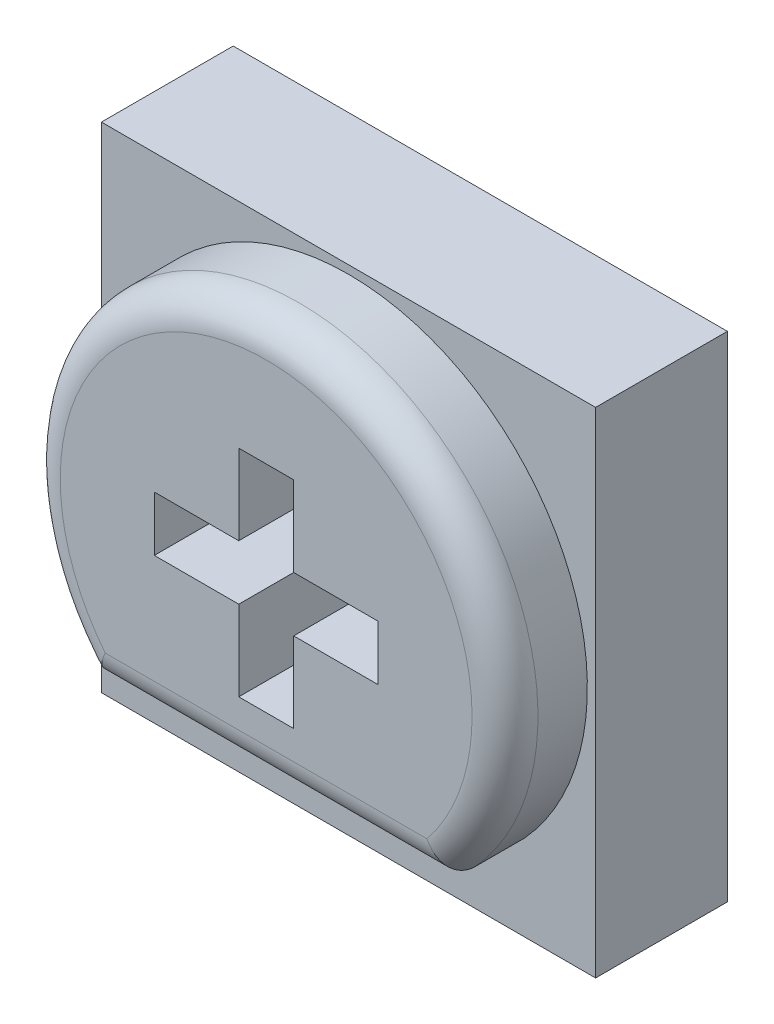
ISO-10303-21;
HEADER;
FILE_DESCRIPTION(('STEP AP214'),'2;1');
FILE_NAME('part.step','',(''),(''),'','','');
FILE_SCHEMA(('AUTOMOTIVE_DESIGN { 1 0 10303 214 1 1 1 1 }'));
ENDSEC;
DATA;
#1=APPLICATION_CONTEXT('core data for automotive mechanical design processes');
#2=APPLICATION_PROTOCOL_DEFINITION('international standard','automotive_design',2000,#1);
#3=PRODUCT_CONTEXT('',#1,'mechanical');
#4=PRODUCT('Part','Part','',(#3));
#5=PRODUCT_RELATED_PRODUCT_CATEGORY('part','',(#4));
#6=PRODUCT_DEFINITION_FORMATION('','',#4);
#7=PRODUCT_DEFINITION_CONTEXT('part definition',#1,'design');
#8=PRODUCT_DEFINITION('design','',#6,#7);
#9=PRODUCT_DEFINITION_SHAPE('','',#8);
#10=(LENGTH_UNIT() NAMED_UNIT(*) SI_UNIT(.MILLI.,.METRE.));
#11=(NAMED_UNIT(*) PLANE_ANGLE_UNIT() SI_UNIT($,.RADIAN.));
#12=(NAMED_UNIT(*) SI_UNIT($,.STERADIAN.) SOLID_ANGLE_UNIT());
#13=UNCERTAINTY_MEASURE_WITH_UNIT(LENGTH_MEASURE(1.E-05),#10,'distance_accuracy_value','');
#14=(GEOMETRIC_REPRESENTATION_CONTEXT(3) GLOBAL_UNCERTAINTY_ASSIGNED_CONTEXT((#13)) GLOBAL_UNIT_ASSIGNED_CONTEXT((#10,
#11,#12)) REPRESENTATION_CONTEXT('',''));
#15=CARTESIAN_POINT('',(0.,0.,0.));
#16=DIRECTION('',(0.,0.,1.));
#17=DIRECTION('',(1.,0.,0.));
#18=AXIS2_PLACEMENT_3D('',#15,#16,#17);
#19=CARTESIAN_POINT('',(0.,0.,1.3));
#20=DIRECTION('',(0.,0.,1.));
#21=DIRECTION('',(1.,0.,0.));
#22=AXIS2_PLACEMENT_3D('',#19,#20,#21);
#23=PLANE('',#22);
#24=CARTESIAN_POINT('',(0.,0.,1.3));
#25=DIRECTION('',(0.,0.,1.));
#26=DIRECTION('',(1.,0.,0.));
#27=AXIS2_PLACEMENT_3D('',#24,#25,#26);
#28=CIRCLE('',#27,1.25);
#29=CARTESIAN_POINT('',(0.976722388353635,-0.780072673594436,1.3));
#30=VERTEX_POINT('',#29);
#31=CARTESIAN_POINT('',(-0.976722388353635,-0.780072673594436,1.3));
#32=VERTEX_POINT('',#31);
#33=EDGE_CURVE('E267',#30,#32,#28,.T.);
#34=ORIENTED_EDGE('',*,*,#33,.T.);
#35=DIRECTION('',(1.,0.,0.));
#36=VECTOR('',#35,1.);
#37=CARTESIAN_POINT('',(1.06862414088005,-0.780072673595366,1.3));
#38=LINE('',#37,#36);
#39=EDGE_CURVE('E270',#32,#30,#38,.T.);
#40=ORIENTED_EDGE('',*,*,#39,.T.);
#41=EDGE_LOOP('',(#34,#40));
#42=FACE_BOUND('',#41,.T.);
#43=DIRECTION('',(0.,1.,0.));
#44=VECTOR('',#43,1.);
#45=CARTESIAN_POINT('',(-0.6790503810102,-0.117737433853022,1.3));
#46=LINE('',#45,#44);
#47=CARTESIAN_POINT('',(-0.6790503810102,-0.117737433853022,1.3));
#48=VERTEX_POINT('',#47);
#49=CARTESIAN_POINT('',(-0.6790503810102,0.215595899480311,1.3));
#50=VERTEX_POINT('',#49);
#51=EDGE_CURVE('E198',#48,#50,#46,.T.);
#52=ORIENTED_EDGE('',*,*,#51,.T.);
#53=DIRECTION('',(1.,0.,0.));
#54=VECTOR('',#53,1.);
#55=CARTESIAN_POINT('',(-0.6790503810102,0.215595899480311,1.3));
#56=LINE('',#55,#54);
#57=CARTESIAN_POINT('',(-0.166229868189687,0.215595899480311,1.3));
#58=VERTEX_POINT('',#57);
#59=EDGE_CURVE('E389',#50,#58,#56,.T.);
#60=ORIENTED_EDGE('',*,*,#59,.T.);
#61=DIRECTION('',(0.,1.,0.));
#62=VECTOR('',#61,1.);
#63=CARTESIAN_POINT('',(-0.166229868189687,0.215595899480311,1.3));
#64=LINE('',#63,#62);
#65=CARTESIAN_POINT('',(-0.166229868189687,0.702775386659798,1.3));
#66=VERTEX_POINT('',#65);
#67=EDGE_CURVE('E202',#58,#66,#64,.T.);
#68=ORIENTED_EDGE('',*,*,#67,.T.);
#69=DIRECTION('',(1.,0.,0.));
#70=VECTOR('',#69,1.);
#71=CARTESIAN_POINT('',(-0.166229868189687,0.702775386659798,1.3));
#72=LINE('',#71,#70);
#73=CARTESIAN_POINT('',(0.167103465143646,0.702775386659798,1.3));
#74=VERTEX_POINT('',#73);
#75=EDGE_CURVE('E394',#66,#74,#72,.T.);
#76=ORIENTED_EDGE('',*,*,#75,.T.);
#77=DIRECTION('',(0.,-1.,0.));
#78=VECTOR('',#77,1.);
#79=CARTESIAN_POINT('',(0.167103465143646,0.702775386659798,1.3));
#80=LINE('',#79,#78);
#81=CARTESIAN_POINT('',(0.167103465143646,0.215595899480311,1.3));
#82=VERTEX_POINT('',#81);
#83=EDGE_CURVE('E403',#74,#82,#80,.T.);
#84=ORIENTED_EDGE('',*,*,#83,.T.);
#85=DIRECTION('',(1.,0.,0.));
#86=VECTOR('',#85,1.);
#87=CARTESIAN_POINT('',(0.167103465143646,0.215595899480311,1.3));
#88=LINE('',#87,#86);
#89=CARTESIAN_POINT('',(0.679923977964159,0.215595899480311,1.3));
#90=VERTEX_POINT('',#89);
#91=EDGE_CURVE('E407',#82,#90,#88,.T.);
#92=ORIENTED_EDGE('',*,*,#91,.T.);
#93=DIRECTION('',(0.,-1.,0.));
#94=VECTOR('',#93,1.);
#95=CARTESIAN_POINT('',(0.679923977964159,0.215595899480311,1.3));
#96=LINE('',#95,#94);
#97=CARTESIAN_POINT('',(0.679923977964159,-0.117737433853022,1.3));
#98=VERTEX_POINT('',#97);
#99=EDGE_CURVE('E411',#90,#98,#96,.T.);
#100=ORIENTED_EDGE('',*,*,#99,.T.);
#101=DIRECTION('',(-1.,0.,0.));
#102=VECTOR('',#101,1.);
#103=CARTESIAN_POINT('',(0.679923977964159,-0.117737433853022,1.3));
#104=LINE('',#103,#102);
#105=CARTESIAN_POINT('',(0.167103465143646,-0.117737433853022,1.3));
#106=VERTEX_POINT('',#105);
#107=EDGE_CURVE('E415',#98,#106,#104,.T.);
#108=ORIENTED_EDGE('',*,*,#107,.T.);
#109=DIRECTION('',(0.,-1.,0.));
#110=VECTOR('',#109,1.);
#111=CARTESIAN_POINT('',(0.167103465143646,-0.117737433853022,1.3));
#112=LINE('',#111,#110);
#113=CARTESIAN_POINT('',(0.167103465143646,-0.60491692103251,1.3));
#114=VERTEX_POINT('',#113);
#115=EDGE_CURVE('E419',#106,#114,#112,.T.);
#116=ORIENTED_EDGE('',*,*,#115,.T.);
#117=DIRECTION('',(-1.,0.,0.));
#118=VECTOR('',#117,1.);
#119=CARTESIAN_POINT('',(0.167103465143646,-0.60491692103251,1.3));
#120=LINE('',#119,#118);
#121=CARTESIAN_POINT('',(-0.166229868189687,-0.60491692103251,1.3));
#122=VERTEX_POINT('',#121);
#123=EDGE_CURVE('E423',#114,#122,#120,.T.);
#124=ORIENTED_EDGE('',*,*,#123,.T.);
#125=DIRECTION('',(0.,1.,0.));
#126=VECTOR('',#125,1.);
#127=CARTESIAN_POINT('',(-0.166229868189687,-0.60491692103251,1.3));
#128=LINE('',#127,#126);
#129=CARTESIAN_POINT('',(-0.166229868189687,-0.117737433853022,1.3));
#130=VERTEX_POINT('',#129);
#131=EDGE_CURVE('E427',#122,#130,#128,.T.);
#132=ORIENTED_EDGE('',*,*,#131,.T.);
#133=DIRECTION('',(-1.,0.,0.));
#134=VECTOR('',#133,1.);
#135=CARTESIAN_POINT('',(-0.166229868189687,-0.117737433853022,1.3));
#136=LINE('',#135,#134);
#137=EDGE_CURVE('E431',#130,#48,#136,.T.);
#138=ORIENTED_EDGE('',*,*,#137,.T.);
#139=EDGE_LOOP('',(#52,#60,#68,#76,#84,#92,#100,#108,#116,#124,#132,#138));
#140=FACE_BOUND('',#139,.T.);
#141=ADVANCED_FACE('F39',(#42,#140),#23,.T.);
#142=CARTESIAN_POINT('',(1.5,1.5,0.8));
#143=DIRECTION('',(-1.,0.,0.));
#144=DIRECTION('',(0.,-1.,0.));
#145=AXIS2_PLACEMENT_3D('',#142,#143,#144);
#146=PLANE('',#145);
#147=DIRECTION('',(0.,1.,0.));
#148=VECTOR('',#147,1.);
#149=CARTESIAN_POINT('',(1.5,1.5,0.));
#150=LINE('',#149,#148);
#151=CARTESIAN_POINT('',(1.5,-1.5,0.));
#152=VERTEX_POINT('',#151);
#153=CARTESIAN_POINT('',(1.5,1.5,0.));
#154=VERTEX_POINT('',#153);
#155=EDGE_CURVE('E225',#152,#154,#150,.T.);
#156=ORIENTED_EDGE('',*,*,#155,.T.);
#157=DIRECTION('',(0.,0.,-1.));
#158=VECTOR('',#157,1.);
#159=CARTESIAN_POINT('',(1.5,1.5,0.8));
#160=LINE('',#159,#158);
#161=CARTESIAN_POINT('',(1.5,1.5,0.8));
#162=VERTEX_POINT('',#161);
#163=EDGE_CURVE('E263',#162,#154,#160,.T.);
#164=ORIENTED_EDGE('',*,*,#163,.F.);
#165=DIRECTION('',(0.,1.,0.));
#166=VECTOR('',#165,1.);
#167=CARTESIAN_POINT('',(1.5,1.5,0.8));
#168=LINE('',#167,#166);
#169=CARTESIAN_POINT('',(1.5,-1.5,0.8));
#170=VERTEX_POINT('',#169);
#171=EDGE_CURVE('E226',#170,#162,#168,.T.);
#172=ORIENTED_EDGE('',*,*,#171,.F.);
#173=DIRECTION('',(0.,0.,-1.));
#174=VECTOR('',#173,1.);
#175=CARTESIAN_POINT('',(1.5,-1.5,0.8));
#176=LINE('',#175,#174);
#177=EDGE_CURVE('E240',#170,#152,#176,.T.);
#178=ORIENTED_EDGE('',*,*,#177,.T.);
#179=EDGE_LOOP('',(#156,#164,#172,#178));
#180=FACE_BOUND('',#179,.T.);
#181=ADVANCED_FACE('F286',(#180),#146,.F.);
#182=CARTESIAN_POINT('',(-1.5,1.5,0.8));
#183=DIRECTION('',(0.,-1.,0.));
#184=DIRECTION('',(0.,0.,-1.));
#185=AXIS2_PLACEMENT_3D('',#182,#183,#184);
#186=PLANE('',#185);
#187=DIRECTION('',(-1.,0.,0.));
#188=VECTOR('',#187,1.);
#189=CARTESIAN_POINT('',(-1.5,1.5,0.));
#190=LINE('',#189,#188);
#191=CARTESIAN_POINT('',(-1.5,1.5,0.));
#192=VERTEX_POINT('',#191);
#193=EDGE_CURVE('E244',#154,#192,#190,.T.);
#194=ORIENTED_EDGE('',*,*,#193,.T.);
#195=DIRECTION('',(0.,0.,-1.));
#196=VECTOR('',#195,1.);
#197=CARTESIAN_POINT('',(-1.5,1.5,0.8));
#198=LINE('',#197,#196);
#199=CARTESIAN_POINT('',(-1.5,1.5,0.8));
#200=VERTEX_POINT('',#199);
#201=EDGE_CURVE('E259',#200,#192,#198,.T.);
#202=ORIENTED_EDGE('',*,*,#201,.F.);
#203=DIRECTION('',(-1.,0.,0.));
#204=VECTOR('',#203,1.);
#205=CARTESIAN_POINT('',(-1.5,1.5,0.8));
#206=LINE('',#205,#204);
#207=EDGE_CURVE('E230',#162,#200,#206,.T.);
#208=ORIENTED_EDGE('',*,*,#207,.F.);
#209=ORIENTED_EDGE('',*,*,#163,.T.);
#210=EDGE_LOOP('',(#194,#202,#208,#209));
#211=FACE_BOUND('',#210,.T.);
#212=ADVANCED_FACE('F290',(#211),#186,.F.);
#213=CARTESIAN_POINT('',(-1.5,1.5,0.8));
#214=DIRECTION('',(1.,0.,0.));
#215=DIRECTION('',(0.,1.,0.));
#216=AXIS2_PLACEMENT_3D('',#213,#214,#215);
#217=PLANE('',#216);
#218=DIRECTION('',(0.,-1.,0.));
#219=VECTOR('',#218,1.);
#220=CARTESIAN_POINT('',(-1.5,1.5,0.));
#221=LINE('',#220,#219);
#222=CARTESIAN_POINT('',(-1.5,-1.5,0.));
#223=VERTEX_POINT('',#222);
#224=EDGE_CURVE('E247',#192,#223,#221,.T.);
#225=ORIENTED_EDGE('',*,*,#224,.T.);
#226=DIRECTION('',(0.,0.,-1.));
#227=VECTOR('',#226,1.);
#228=CARTESIAN_POINT('',(-1.5,-1.5,0.8));
#229=LINE('',#228,#227);
#230=CARTESIAN_POINT('',(-1.5,-1.5,0.8));
#231=VERTEX_POINT('',#230);
#232=EDGE_CURVE('E255',#231,#223,#229,.T.);
#233=ORIENTED_EDGE('',*,*,#232,.F.);
#234=DIRECTION('',(0.,-1.,0.));
#235=VECTOR('',#234,1.);
#236=CARTESIAN_POINT('',(-1.5,1.5,0.8));
#237=LINE('',#236,#235);
#238=EDGE_CURVE('E234',#200,#231,#237,.T.);
#239=ORIENTED_EDGE('',*,*,#238,.F.);
#240=ORIENTED_EDGE('',*,*,#201,.T.);
#241=EDGE_LOOP('',(#225,#233,#239,#240));
#242=FACE_BOUND('',#241,.T.);
#243=ADVANCED_FACE('F294',(#242),#217,.F.);
#244=CARTESIAN_POINT('',(-1.5,-1.5,0.8));
#245=DIRECTION('',(0.,1.,0.));
#246=DIRECTION('',(0.,0.,1.));
#247=AXIS2_PLACEMENT_3D('',#244,#245,#246);
#248=PLANE('',#247);
#249=DIRECTION('',(1.,0.,0.));
#250=VECTOR('',#249,1.);
#251=CARTESIAN_POINT('',(-1.5,-1.5,0.));
#252=LINE('',#251,#250);
#253=EDGE_CURVE('E231',#223,#152,#252,.T.);
#254=ORIENTED_EDGE('',*,*,#253,.T.);
#255=ORIENTED_EDGE('',*,*,#177,.F.);
#256=DIRECTION('',(1.,0.,0.));
#257=VECTOR('',#256,1.);
#258=CARTESIAN_POINT('',(-1.5,-1.5,0.8));
#259=LINE('',#258,#257);
#260=EDGE_CURVE('E237',#231,#170,#259,.T.);
#261=ORIENTED_EDGE('',*,*,#260,.F.);
#262=ORIENTED_EDGE('',*,*,#232,.T.);
#263=EDGE_LOOP('',(#254,#255,#261,#262));
#264=FACE_BOUND('',#263,.T.);
#265=ADVANCED_FACE('F298',(#264),#248,.F.);
#266=CARTESIAN_POINT('',(0.,0.,0.8));
#267=DIRECTION('',(0.,0.,1.));
#268=DIRECTION('',(1.,0.,0.));
#269=AXIS2_PLACEMENT_3D('',#266,#267,#268);
#270=PLANE('',#269);
#271=CARTESIAN_POINT('',(0.,0.,0.8));
#272=DIRECTION('',(0.,0.,1.));
#273=DIRECTION('',(1.,0.,0.));
#274=AXIS2_PLACEMENT_3D('',#271,#272,#273);
#275=CIRCLE('',#274,1.45);
#276=CARTESIAN_POINT('',(1.06862414088005,-0.980072673595366,0.8));
#277=VERTEX_POINT('',#276);
#278=CARTESIAN_POINT('',(-1.06862414088005,-0.980072673595366,0.8));
#279=VERTEX_POINT('',#278);
#280=EDGE_CURVE('E204',#277,#279,#275,.T.);
#281=ORIENTED_EDGE('',*,*,#280,.F.);
#282=DIRECTION('',(1.,0.,0.));
#283=VECTOR('',#282,1.);
#284=CARTESIAN_POINT('',(-1.06862414088005,-0.980072673595366,0.8));
#285=LINE('',#284,#283);
#286=EDGE_CURVE('E210',#279,#277,#285,.T.);
#287=ORIENTED_EDGE('',*,*,#286,.F.);
#288=EDGE_LOOP('',(#281,#287));
#289=FACE_BOUND('',#288,.T.);
#290=ORIENTED_EDGE('',*,*,#171,.T.);
#291=ORIENTED_EDGE('',*,*,#207,.T.);
#292=ORIENTED_EDGE('',*,*,#238,.T.);
#293=ORIENTED_EDGE('',*,*,#260,.T.);
#294=EDGE_LOOP('',(#290,#291,#292,#293));
#295=FACE_BOUND('',#294,.T.);
#296=ADVANCED_FACE('F302',(#289,#295),#270,.T.);
#297=CARTESIAN_POINT('',(0.,0.,0.));
#298=DIRECTION('',(0.,0.,1.));
#299=DIRECTION('',(1.,0.,0.));
#300=AXIS2_PLACEMENT_3D('',#297,#298,#299);
#301=PLANE('',#300);
#302=ORIENTED_EDGE('',*,*,#155,.F.);
#303=ORIENTED_EDGE('',*,*,#253,.F.);
#304=ORIENTED_EDGE('',*,*,#224,.F.);
#305=ORIENTED_EDGE('',*,*,#193,.F.);
#306=EDGE_LOOP('',(#302,#303,#304,#305));
#307=FACE_BOUND('',#306,.T.);
#308=ADVANCED_FACE('F304',(#307),#301,.F.);
#309=CARTESIAN_POINT('',(0.,0.,1.3));
#310=DIRECTION('',(0.,0.,-1.));
#311=DIRECTION('',(-1.,0.,0.));
#312=AXIS2_PLACEMENT_3D('',#309,#310,#311);
#313=CYLINDRICAL_SURFACE('',#312,1.45);
#314=DIRECTION('',(0.,0.,-1.));
#315=VECTOR('',#314,1.);
#316=CARTESIAN_POINT('',(-1.06862414088005,-0.980072673595366,1.3));
#317=LINE('',#316,#315);
#318=CARTESIAN_POINT('',(-1.06862414088005,-0.980072673595366,1.1));
#319=VERTEX_POINT('',#318);
#320=EDGE_CURVE('E222',#319,#279,#317,.T.);
#321=ORIENTED_EDGE('',*,*,#320,.F.);
#322=CARTESIAN_POINT('',(0.,0.,1.1));
#323=DIRECTION('',(0.,0.,1.));
#324=DIRECTION('',(1.,0.,0.));
#325=AXIS2_PLACEMENT_3D('',#322,#323,#324);
#326=CIRCLE('',#325,1.45);
#327=CARTESIAN_POINT('',(1.06862414088005,-0.980072673595366,1.1));
#328=VERTEX_POINT('',#327);
#329=EDGE_CURVE('E11',#319,#328,#326,.F.);
#330=ORIENTED_EDGE('',*,*,#329,.T.);
#331=DIRECTION('',(0.,0.,-1.));
#332=VECTOR('',#331,1.);
#333=CARTESIAN_POINT('',(1.06862414088005,-0.980072673595366,1.3));
#334=LINE('',#333,#332);
#335=EDGE_CURVE('E219',#328,#277,#334,.T.);
#336=ORIENTED_EDGE('',*,*,#335,.T.);
#337=ORIENTED_EDGE('',*,*,#280,.T.);
#338=EDGE_LOOP('',(#321,#330,#336,#337));
#339=FACE_BOUND('',#338,.T.);
#340=ADVANCED_FACE('F307',(#339),#313,.T.);
#341=CARTESIAN_POINT('',(-1.06862414088005,-0.980072673595366,1.3));
#342=DIRECTION('',(0.,1.,0.));
#343=DIRECTION('',(0.,0.,1.));
#344=AXIS2_PLACEMENT_3D('',#341,#342,#343);
#345=PLANE('',#344);
#346=ORIENTED_EDGE('',*,*,#335,.F.);
#347=DIRECTION('',(1.,0.,0.));
#348=VECTOR('',#347,1.);
#349=CARTESIAN_POINT('',(-1.06862414088005,-0.980072673595366,1.1));
#350=LINE('',#349,#348);
#351=EDGE_CURVE('E54',#328,#319,#350,.F.);
#352=ORIENTED_EDGE('',*,*,#351,.T.);
#353=ORIENTED_EDGE('',*,*,#320,.T.);
#354=ORIENTED_EDGE('',*,*,#286,.T.);
#355=EDGE_LOOP('',(#346,#352,#353,#354));
#356=FACE_BOUND('',#355,.T.);
#357=ADVANCED_FACE('F314',(#356),#345,.F.);
#358=CARTESIAN_POINT('',(-0.6790503810102,0.215595899480311,0.5));
#359=DIRECTION('',(0.,-1.,0.));
#360=DIRECTION('',(0.,0.,-1.));
#361=AXIS2_PLACEMENT_3D('',#358,#359,#360);
#362=PLANE('',#361);
#363=ORIENTED_EDGE('',*,*,#59,.F.);
#364=DIRECTION('',(0.,0.,1.));
#365=VECTOR('',#364,1.);
#366=CARTESIAN_POINT('',(-0.6790503810102,0.215595899480311,0.5));
#367=LINE('',#366,#365);
#368=CARTESIAN_POINT('',(-0.6790503810102,0.215595899480311,0.5));
#369=VERTEX_POINT('',#368);
#370=EDGE_CURVE('E196',#369,#50,#367,.T.);
#371=ORIENTED_EDGE('',*,*,#370,.F.);
#372=DIRECTION('',(1.,0.,0.));
#373=VECTOR('',#372,1.);
#374=CARTESIAN_POINT('',(-0.6790503810102,0.215595899480311,0.5));
#375=LINE('',#374,#373);
#376=CARTESIAN_POINT('',(-0.166229868189687,0.215595899480311,0.5));
#377=VERTEX_POINT('',#376);
#378=EDGE_CURVE('E181',#369,#377,#375,.T.);
#379=ORIENTED_EDGE('',*,*,#378,.T.);
#380=DIRECTION('',(0.,0.,1.));
#381=VECTOR('',#380,1.);
#382=CARTESIAN_POINT('',(-0.166229868189687,0.215595899480311,0.5));
#383=LINE('',#382,#381);
#384=EDGE_CURVE('E193',#377,#58,#383,.T.);
#385=ORIENTED_EDGE('',*,*,#384,.T.);
#386=EDGE_LOOP('',(#363,#371,#379,#385));
#387=FACE_BOUND('',#386,.T.);
#388=ADVANCED_FACE('F192',(#387),#362,.T.);
#389=CARTESIAN_POINT('',(-0.166229868189687,0.215595899480311,0.5));
#390=DIRECTION('',(1.,0.,0.));
#391=DIRECTION('',(0.,0.,-1.));
#392=AXIS2_PLACEMENT_3D('',#389,#390,#391);
#393=PLANE('',#392);
#394=ORIENTED_EDGE('',*,*,#67,.F.);
#395=ORIENTED_EDGE('',*,*,#384,.F.);
#396=DIRECTION('',(0.,1.,0.));
#397=VECTOR('',#396,1.);
#398=CARTESIAN_POINT('',(-0.166229868189687,0.215595899480311,0.5));
#399=LINE('',#398,#397);
#400=CARTESIAN_POINT('',(-0.166229868189687,0.702775386659798,0.5));
#401=VERTEX_POINT('',#400);
#402=EDGE_CURVE('E177',#377,#401,#399,.T.);
#403=ORIENTED_EDGE('',*,*,#402,.T.);
#404=DIRECTION('',(0.,0.,1.));
#405=VECTOR('',#404,1.);
#406=CARTESIAN_POINT('',(-0.166229868189687,0.702775386659798,0.5));
#407=LINE('',#406,#405);
#408=EDGE_CURVE('E205',#401,#66,#407,.T.);
#409=ORIENTED_EDGE('',*,*,#408,.T.);
#410=EDGE_LOOP('',(#394,#395,#403,#409));
#411=FACE_BOUND('',#410,.T.);
#412=ADVANCED_FACE('F200',(#411),#393,.T.);
#413=CARTESIAN_POINT('',(-0.166229868189687,0.702775386659798,0.5));
#414=DIRECTION('',(0.,-1.,0.));
#415=DIRECTION('',(0.,0.,-1.));
#416=AXIS2_PLACEMENT_3D('',#413,#414,#415);
#417=PLANE('',#416);
#418=ORIENTED_EDGE('',*,*,#75,.F.);
#419=ORIENTED_EDGE('',*,*,#408,.F.);
#420=DIRECTION('',(1.,0.,0.));
#421=VECTOR('',#420,1.);
#422=CARTESIAN_POINT('',(-0.166229868189687,0.702775386659798,0.5));
#423=LINE('',#422,#421);
#424=CARTESIAN_POINT('',(0.167103465143646,0.702775386659798,0.5));
#425=VERTEX_POINT('',#424);
#426=EDGE_CURVE('E183',#401,#425,#423,.T.);
#427=ORIENTED_EDGE('',*,*,#426,.T.);
#428=DIRECTION('',(0.,0.,1.));
#429=VECTOR('',#428,1.);
#430=CARTESIAN_POINT('',(0.167103465143646,0.702775386659798,0.5));
#431=LINE('',#430,#429);
#432=EDGE_CURVE('E212',#425,#74,#431,.T.);
#433=ORIENTED_EDGE('',*,*,#432,.T.);
#434=EDGE_LOOP('',(#418,#419,#427,#433));
#435=FACE_BOUND('',#434,.T.);
#436=ADVANCED_FACE('F325',(#435),#417,.T.);
#437=CARTESIAN_POINT('',(0.167103465143646,0.702775386659798,0.5));
#438=DIRECTION('',(-1.,0.,0.));
#439=DIRECTION('',(0.,0.,1.));
#440=AXIS2_PLACEMENT_3D('',#437,#438,#439);
#441=PLANE('',#440);
#442=ORIENTED_EDGE('',*,*,#83,.F.);
#443=ORIENTED_EDGE('',*,*,#432,.F.);
#444=DIRECTION('',(0.,-1.,0.));
#445=VECTOR('',#444,1.);
#446=CARTESIAN_POINT('',(0.167103465143646,0.702775386659798,0.5));
#447=LINE('',#446,#445);
#448=CARTESIAN_POINT('',(0.167103465143646,0.215595899480311,0.5));
#449=VERTEX_POINT('',#448);
#450=EDGE_CURVE('E495',#425,#449,#447,.T.);
#451=ORIENTED_EDGE('',*,*,#450,.T.);
#452=DIRECTION('',(0.,0.,1.));
#453=VECTOR('',#452,1.);
#454=CARTESIAN_POINT('',(0.167103465143646,0.215595899480311,0.5));
#455=LINE('',#454,#453);
#456=EDGE_CURVE('E460',#449,#82,#455,.T.);
#457=ORIENTED_EDGE('',*,*,#456,.T.);
#458=EDGE_LOOP('',(#442,#443,#451,#457));
#459=FACE_BOUND('',#458,.T.);
#460=ADVANCED_FACE('F328',(#459),#441,.T.);
#461=CARTESIAN_POINT('',(0.167103465143646,0.215595899480311,0.5));
#462=DIRECTION('',(0.,-1.,0.));
#463=DIRECTION('',(0.,0.,-1.));
#464=AXIS2_PLACEMENT_3D('',#461,#462,#463);
#465=PLANE('',#464);
#466=ORIENTED_EDGE('',*,*,#91,.F.);
#467=ORIENTED_EDGE('',*,*,#456,.F.);
#468=DIRECTION('',(1.,0.,0.));
#469=VECTOR('',#468,1.);
#470=CARTESIAN_POINT('',(0.167103465143646,0.215595899480311,0.5));
#471=LINE('',#470,#469);
#472=CARTESIAN_POINT('',(0.679923977964159,0.215595899480311,0.5));
#473=VERTEX_POINT('',#472);
#474=EDGE_CURVE('E492',#449,#473,#471,.T.);
#475=ORIENTED_EDGE('',*,*,#474,.T.);
#476=DIRECTION('',(0.,0.,1.));
#477=VECTOR('',#476,1.);
#478=CARTESIAN_POINT('',(0.679923977964159,0.215595899480311,0.5));
#479=LINE('',#478,#477);
#480=EDGE_CURVE('E457',#473,#90,#479,.T.);
#481=ORIENTED_EDGE('',*,*,#480,.T.);
#482=EDGE_LOOP('',(#466,#467,#475,#481));
#483=FACE_BOUND('',#482,.T.);
#484=ADVANCED_FACE('F332',(#483),#465,.T.);
#485=CARTESIAN_POINT('',(0.679923977964159,0.215595899480311,0.5));
#486=DIRECTION('',(-1.,0.,0.));
#487=DIRECTION('',(0.,0.,1.));
#488=AXIS2_PLACEMENT_3D('',#485,#486,#487);
#489=PLANE('',#488);
#490=ORIENTED_EDGE('',*,*,#99,.F.);
#491=ORIENTED_EDGE('',*,*,#480,.F.);
#492=DIRECTION('',(0.,-1.,0.));
#493=VECTOR('',#492,1.);
#494=CARTESIAN_POINT('',(0.679923977964159,0.215595899480311,0.5));
#495=LINE('',#494,#493);
#496=CARTESIAN_POINT('',(0.679923977964159,-0.117737433853022,0.5));
#497=VERTEX_POINT('',#496);
#498=EDGE_CURVE('E489',#473,#497,#495,.T.);
#499=ORIENTED_EDGE('',*,*,#498,.T.);
#500=DIRECTION('',(0.,0.,1.));
#501=VECTOR('',#500,1.);
#502=CARTESIAN_POINT('',(0.679923977964159,-0.117737433853022,0.5));
#503=LINE('',#502,#501);
#504=EDGE_CURVE('E454',#497,#98,#503,.T.);
#505=ORIENTED_EDGE('',*,*,#504,.T.);
#506=EDGE_LOOP('',(#490,#491,#499,#505));
#507=FACE_BOUND('',#506,.T.);
#508=ADVANCED_FACE('F336',(#507),#489,.T.);
#509=CARTESIAN_POINT('',(0.679923977964159,-0.117737433853022,0.5));
#510=DIRECTION('',(0.,1.,0.));
#511=DIRECTION('',(0.,0.,1.));
#512=AXIS2_PLACEMENT_3D('',#509,#510,#511);
#513=PLANE('',#512);
#514=ORIENTED_EDGE('',*,*,#107,.F.);
#515=ORIENTED_EDGE('',*,*,#504,.F.);
#516=DIRECTION('',(-1.,0.,0.));
#517=VECTOR('',#516,1.);
#518=CARTESIAN_POINT('',(0.679923977964159,-0.117737433853022,0.5));
#519=LINE('',#518,#517);
#520=CARTESIAN_POINT('',(0.167103465143646,-0.117737433853022,0.5));
#521=VERTEX_POINT('',#520);
#522=EDGE_CURVE('E486',#497,#521,#519,.T.);
#523=ORIENTED_EDGE('',*,*,#522,.T.);
#524=DIRECTION('',(0.,0.,1.));
#525=VECTOR('',#524,1.);
#526=CARTESIAN_POINT('',(0.167103465143646,-0.117737433853022,0.5));
#527=LINE('',#526,#525);
#528=EDGE_CURVE('E451',#521,#106,#527,.T.);
#529=ORIENTED_EDGE('',*,*,#528,.T.);
#530=EDGE_LOOP('',(#514,#515,#523,#529));
#531=FACE_BOUND('',#530,.T.);
#532=ADVANCED_FACE('F340',(#531),#513,.T.);
#533=CARTESIAN_POINT('',(0.167103465143646,-0.117737433853022,0.5));
#534=DIRECTION('',(-1.,0.,0.));
#535=DIRECTION('',(0.,0.,1.));
#536=AXIS2_PLACEMENT_3D('',#533,#534,#535);
#537=PLANE('',#536);
#538=ORIENTED_EDGE('',*,*,#115,.F.);
#539=ORIENTED_EDGE('',*,*,#528,.F.);
#540=DIRECTION('',(0.,-1.,0.));
#541=VECTOR('',#540,1.);
#542=CARTESIAN_POINT('',(0.167103465143646,-0.117737433853022,0.5));
#543=LINE('',#542,#541);
#544=CARTESIAN_POINT('',(0.167103465143646,-0.60491692103251,0.5));
#545=VERTEX_POINT('',#544);
#546=EDGE_CURVE('E483',#521,#545,#543,.T.);
#547=ORIENTED_EDGE('',*,*,#546,.T.);
#548=DIRECTION('',(0.,0.,1.));
#549=VECTOR('',#548,1.);
#550=CARTESIAN_POINT('',(0.167103465143646,-0.60491692103251,0.5));
#551=LINE('',#550,#549);
#552=EDGE_CURVE('E448',#545,#114,#551,.T.);
#553=ORIENTED_EDGE('',*,*,#552,.T.);
#554=EDGE_LOOP('',(#538,#539,#547,#553));
#555=FACE_BOUND('',#554,.T.);
#556=ADVANCED_FACE('F344',(#555),#537,.T.);
#557=CARTESIAN_POINT('',(0.167103465143646,-0.60491692103251,0.5));
#558=DIRECTION('',(0.,1.,0.));
#559=DIRECTION('',(0.,0.,1.));
#560=AXIS2_PLACEMENT_3D('',#557,#558,#559);
#561=PLANE('',#560);
#562=ORIENTED_EDGE('',*,*,#123,.F.);
#563=ORIENTED_EDGE('',*,*,#552,.F.);
#564=DIRECTION('',(-1.,0.,0.));
#565=VECTOR('',#564,1.);
#566=CARTESIAN_POINT('',(0.167103465143646,-0.60491692103251,0.5));
#567=LINE('',#566,#565);
#568=CARTESIAN_POINT('',(-0.166229868189687,-0.60491692103251,0.5));
#569=VERTEX_POINT('',#568);
#570=EDGE_CURVE('E478',#545,#569,#567,.T.);
#571=ORIENTED_EDGE('',*,*,#570,.T.);
#572=DIRECTION('',(0.,0.,1.));
#573=VECTOR('',#572,1.);
#574=CARTESIAN_POINT('',(-0.166229868189687,-0.60491692103251,0.5));
#575=LINE('',#574,#573);
#576=EDGE_CURVE('E445',#569,#122,#575,.T.);
#577=ORIENTED_EDGE('',*,*,#576,.T.);
#578=EDGE_LOOP('',(#562,#563,#571,#577));
#579=FACE_BOUND('',#578,.T.);
#580=ADVANCED_FACE('F348',(#579),#561,.T.);
#581=CARTESIAN_POINT('',(-0.166229868189687,-0.60491692103251,0.5));
#582=DIRECTION('',(1.,0.,0.));
#583=DIRECTION('',(0.,0.,-1.));
#584=AXIS2_PLACEMENT_3D('',#581,#582,#583);
#585=PLANE('',#584);
#586=ORIENTED_EDGE('',*,*,#131,.F.);
#587=ORIENTED_EDGE('',*,*,#576,.F.);
#588=DIRECTION('',(0.,1.,0.));
#589=VECTOR('',#588,1.);
#590=CARTESIAN_POINT('',(-0.166229868189687,-0.60491692103251,0.5));
#591=LINE('',#590,#589);
#592=CARTESIAN_POINT('',(-0.166229868189687,-0.117737433853022,0.5));
#593=VERTEX_POINT('',#592);
#594=EDGE_CURVE('E475',#569,#593,#591,.T.);
#595=ORIENTED_EDGE('',*,*,#594,.T.);
#596=DIRECTION('',(0.,0.,1.));
#597=VECTOR('',#596,1.);
#598=CARTESIAN_POINT('',(-0.166229868189687,-0.117737433853022,0.5));
#599=LINE('',#598,#597);
#600=EDGE_CURVE('E442',#593,#130,#599,.T.);
#601=ORIENTED_EDGE('',*,*,#600,.T.);
#602=EDGE_LOOP('',(#586,#587,#595,#601));
#603=FACE_BOUND('',#602,.T.);
#604=ADVANCED_FACE('F352',(#603),#585,.T.);
#605=CARTESIAN_POINT('',(-0.166229868189687,-0.117737433853022,0.5));
#606=DIRECTION('',(0.,1.,0.));
#607=DIRECTION('',(0.,0.,1.));
#608=AXIS2_PLACEMENT_3D('',#605,#606,#607);
#609=PLANE('',#608);
#610=ORIENTED_EDGE('',*,*,#137,.F.);
#611=ORIENTED_EDGE('',*,*,#600,.F.);
#612=DIRECTION('',(-1.,0.,0.));
#613=VECTOR('',#612,1.);
#614=CARTESIAN_POINT('',(-0.166229868189687,-0.117737433853022,0.5));
#615=LINE('',#614,#613);
#616=CARTESIAN_POINT('',(-0.6790503810102,-0.117737433853022,0.5));
#617=VERTEX_POINT('',#616);
#618=EDGE_CURVE('E473',#593,#617,#615,.T.);
#619=ORIENTED_EDGE('',*,*,#618,.T.);
#620=DIRECTION('',(0.,0.,1.));
#621=VECTOR('',#620,1.);
#622=CARTESIAN_POINT('',(-0.6790503810102,-0.117737433853022,0.5));
#623=LINE('',#622,#621);
#624=EDGE_CURVE('E439',#617,#48,#623,.T.);
#625=ORIENTED_EDGE('',*,*,#624,.T.);
#626=EDGE_LOOP('',(#610,#611,#619,#625));
#627=FACE_BOUND('',#626,.T.);
#628=ADVANCED_FACE('F356',(#627),#609,.T.);
#629=CARTESIAN_POINT('',(-0.6790503810102,-0.117737433853022,0.5));
#630=DIRECTION('',(1.,0.,0.));
#631=DIRECTION('',(0.,0.,-1.));
#632=AXIS2_PLACEMENT_3D('',#629,#630,#631);
#633=PLANE('',#632);
#634=ORIENTED_EDGE('',*,*,#51,.F.);
#635=ORIENTED_EDGE('',*,*,#624,.F.);
#636=DIRECTION('',(0.,1.,0.));
#637=VECTOR('',#636,1.);
#638=CARTESIAN_POINT('',(-0.6790503810102,-0.117737433853022,0.5));
#639=LINE('',#638,#637);
#640=EDGE_CURVE('E397',#617,#369,#639,.T.);
#641=ORIENTED_EDGE('',*,*,#640,.T.);
#642=ORIENTED_EDGE('',*,*,#370,.T.);
#643=EDGE_LOOP('',(#634,#635,#641,#642));
#644=FACE_BOUND('',#643,.T.);
#645=ADVANCED_FACE('F360',(#644),#633,.T.);
#646=CARTESIAN_POINT('',(0.,0.,0.5));
#647=DIRECTION('',(0.,0.,1.));
#648=DIRECTION('',(1.,0.,0.));
#649=AXIS2_PLACEMENT_3D('',#646,#647,#648);
#650=PLANE('',#649);
#651=ORIENTED_EDGE('',*,*,#378,.F.);
#652=ORIENTED_EDGE('',*,*,#640,.F.);
#653=ORIENTED_EDGE('',*,*,#618,.F.);
#654=ORIENTED_EDGE('',*,*,#594,.F.);
#655=ORIENTED_EDGE('',*,*,#570,.F.);
#656=ORIENTED_EDGE('',*,*,#546,.F.);
#657=ORIENTED_EDGE('',*,*,#522,.F.);
#658=ORIENTED_EDGE('',*,*,#498,.F.);
#659=ORIENTED_EDGE('',*,*,#474,.F.);
#660=ORIENTED_EDGE('',*,*,#450,.F.);
#661=ORIENTED_EDGE('',*,*,#426,.F.);
#662=ORIENTED_EDGE('',*,*,#402,.F.);
#663=EDGE_LOOP('',(#651,#652,#653,#654,#655,#656,#657,#658,#659,#660,#661,#662));
#664=FACE_BOUND('',#663,.T.);
#665=ADVANCED_FACE('F179',(#664),#650,.T.);
#666=CARTESIAN_POINT('',(0.,0.,1.1));
#667=DIRECTION('',(0.,0.,1.));
#668=DIRECTION('',(1.,0.,0.));
#669=AXIS2_PLACEMENT_3D('',#666,#667,#668);
#670=TOROIDAL_SURFACE('',#669,1.25,0.2);
#671=CARTESIAN_POINT('',(1.06862414088005,-0.980072673595366,1.1));
#672=CARTESIAN_POINT('',(1.06862877738244,-0.980084892656286,1.11055385822671));
#673=CARTESIAN_POINT('',(1.06825714892109,-0.979238140761556,1.12109973093428));
#674=CARTESIAN_POINT('',(1.0667979997634,-0.975922535779073,1.14185182536485));
#675=CARTESIAN_POINT('',(1.06571258083091,-0.973458445003825,1.15205895212045));
#676=CARTESIAN_POINT('',(1.06286253644352,-0.967003971439888,1.17187218442056));
#677=CARTESIAN_POINT('',(1.06109811629514,-0.963014050011971,1.1814784706188));
#678=CARTESIAN_POINT('',(1.05695043410757,-0.953666833543092,1.1998566095634));
#679=CARTESIAN_POINT('',(1.05456692361638,-0.948308989545124,1.20862812536595));
#680=CARTESIAN_POINT('',(1.04916628474931,-0.936219978493928,1.22541327952572));
#681=CARTESIAN_POINT('',(1.04613099359213,-0.929449649694686,1.23339277789823));
#682=CARTESIAN_POINT('',(1.03956404251412,-0.914876494174229,1.24810549003463));
#683=CARTESIAN_POINT('',(1.03603222660289,-0.907073343022253,1.25483831059053));
#684=CARTESIAN_POINT('',(1.02826113795755,-0.89000252965373,1.26744199038934));
#685=CARTESIAN_POINT('',(1.02398786215229,-0.880667631335978,1.27320066417882));
#686=CARTESIAN_POINT('',(1.01507279336763,-0.861325973056358,1.28307340363904));
#687=CARTESIAN_POINT('',(1.01043083126259,-0.851318905082025,1.28718670925465));
#688=CARTESIAN_POINT('',(1.00123376635672,-0.831636837022603,1.29349452016646));
#689=CARTESIAN_POINT('',(0.996696835984622,-0.821990496087636,1.29580667655096));
#690=CARTESIAN_POINT('',(0.987484892183164,-0.802542804162716,1.29897705190524));
#691=CARTESIAN_POINT('',(0.982810151767205,-0.792741775458933,1.29983797170362));
#692=CARTESIAN_POINT('',(0.977646941357499,-0.781994992269259,1.29999308573319));
#693=CARTESIAN_POINT('',(0.977184770979174,-0.781033708907868,1.30000001513914));
#694=CARTESIAN_POINT('',(0.976722388352892,-0.780072673595366,1.3));
#695=B_SPLINE_CURVE_WITH_KNOTS('',3,(#671,#672,#673,#674,#675,#676,#677,#678,#679,#680,#681,
#682,#683,#684,#685,#686,#687,#688,#689,#690,#691,#692,#693,#694),.UNSPECIFIED.,.F.,.F.,(4,2,2,
2,2,2,2,2,2,2,2,4),(0.,0.0316087378156173,0.0631248176054801,0.0946313754991534,
0.126150597126021,0.158699978796571,0.19125960927107,0.22642633498686,0.261609286778808,
0.294237252545277,0.326804428615449,0.330004234356813),.UNSPECIFIED.);
#696=EDGE_CURVE('E276',#328,#30,#695,.T.);
#697=ORIENTED_EDGE('',*,*,#696,.F.);
#698=ORIENTED_EDGE('',*,*,#329,.F.);
#699=CARTESIAN_POINT('',(-1.06862414088005,-0.980072673595366,1.1));
#700=CARTESIAN_POINT('',(-1.06862877738244,-0.980084892656286,1.11055385822671));
#701=CARTESIAN_POINT('',(-1.06825714892109,-0.979238140761556,1.12109973093428));
#702=CARTESIAN_POINT('',(-1.0667979997634,-0.975922535779073,1.14185182536485));
#703=CARTESIAN_POINT('',(-1.06571258083091,-0.973458445003825,1.15205895212045));
#704=CARTESIAN_POINT('',(-1.06286253644352,-0.967003971439888,1.17187218442056));
#705=CARTESIAN_POINT('',(-1.06109811629514,-0.963014050011971,1.1814784706188));
#706=CARTESIAN_POINT('',(-1.05695043410757,-0.953666833543092,1.1998566095634));
#707=CARTESIAN_POINT('',(-1.05456692361638,-0.948308989545124,1.20862812536595));
#708=CARTESIAN_POINT('',(-1.04916628474931,-0.936219978493928,1.22541327952572));
#709=CARTESIAN_POINT('',(-1.04613099359213,-0.929449649694686,1.23339277789823));
#710=CARTESIAN_POINT('',(-1.03956404251412,-0.914876494174229,1.24810549003463));
#711=CARTESIAN_POINT('',(-1.03603222660289,-0.907073343022253,1.25483831059053));
#712=CARTESIAN_POINT('',(-1.02826113795755,-0.89000252965373,1.26744199038934));
#713=CARTESIAN_POINT('',(-1.02398786215229,-0.880667631335978,1.27320066417882));
#714=CARTESIAN_POINT('',(-1.01507279336763,-0.861325973056358,1.28307340363904));
#715=CARTESIAN_POINT('',(-1.01043083126259,-0.851318905082025,1.28718670925465));
#716=CARTESIAN_POINT('',(-1.00123376635672,-0.831636837022603,1.29349452016646));
#717=CARTESIAN_POINT('',(-0.996696835984623,-0.821990496087635,1.29580667655096));
#718=CARTESIAN_POINT('',(-0.987484892183163,-0.802542804162716,1.29897705190524));
#719=CARTESIAN_POINT('',(-0.982810151767201,-0.792741775458934,1.29983797170362));
#720=CARTESIAN_POINT('',(-0.977646941357498,-0.781994992269259,1.29999308573319));
#721=CARTESIAN_POINT('',(-0.977184770979174,-0.781033708907868,1.30000001513914));
#722=CARTESIAN_POINT('',(-0.976722388352892,-0.780072673595366,1.3));
#723=B_SPLINE_CURVE_WITH_KNOTS('',3,(#699,#700,#701,#702,#703,#704,#705,#706,#707,#708,#709,
#710,#711,#712,#713,#714,#715,#716,#717,#718,#719,#720,#721,#722),.UNSPECIFIED.,.F.,.F.,(4,2,2,
2,2,2,2,2,2,2,2,4),(0.,0.0316087378156173,0.0631248176054801,0.0946313754991534,
0.126150597126021,0.158699978796571,0.19125960927107,0.22642633498686,0.261609286778809,
0.294237252545277,0.326804428615449,0.330004234356813),.UNSPECIFIED.);
#724=EDGE_CURVE('E44',#32,#319,#723,.F.);
#725=ORIENTED_EDGE('',*,*,#724,.F.);
#726=ORIENTED_EDGE('',*,*,#33,.F.);
#727=EDGE_LOOP('',(#697,#698,#725,#726));
#728=FACE_BOUND('',#727,.T.);
#729=ADVANCED_FACE('F41',(#728),#670,.T.);
#730=CARTESIAN_POINT('',(0.,-0.780072673595366,1.1));
#731=DIRECTION('',(-1.,0.,0.));
#732=DIRECTION('',(0.,0.,1.));
#733=AXIS2_PLACEMENT_3D('',#730,#731,#732);
#734=CYLINDRICAL_SURFACE('',#733,0.2);
#735=ORIENTED_EDGE('',*,*,#724,.T.);
#736=ORIENTED_EDGE('',*,*,#351,.F.);
#737=ORIENTED_EDGE('',*,*,#696,.T.);
#738=ORIENTED_EDGE('',*,*,#39,.F.);
#739=EDGE_LOOP('',(#735,#736,#737,#738));
#740=FACE_BOUND('',#739,.T.);
#741=ADVANCED_FACE('F282',(#740),#734,.T.);
#742=CLOSED_SHELL('',(#141,#181,#212,#243,#265,#296,#308,#340,#357,#388,#412,#436,#460,#484,
#508,#532,#556,#580,#604,#628,#645,#665,#729,#741));
#743=MANIFOLD_SOLID_BREP('B2',#742);
#744=ADVANCED_BREP_SHAPE_REPRESENTATION('',(#18,#743),#14);
#745=SHAPE_DEFINITION_REPRESENTATION(#9,#744);
ENDSEC;
END-ISO-10303-21;
